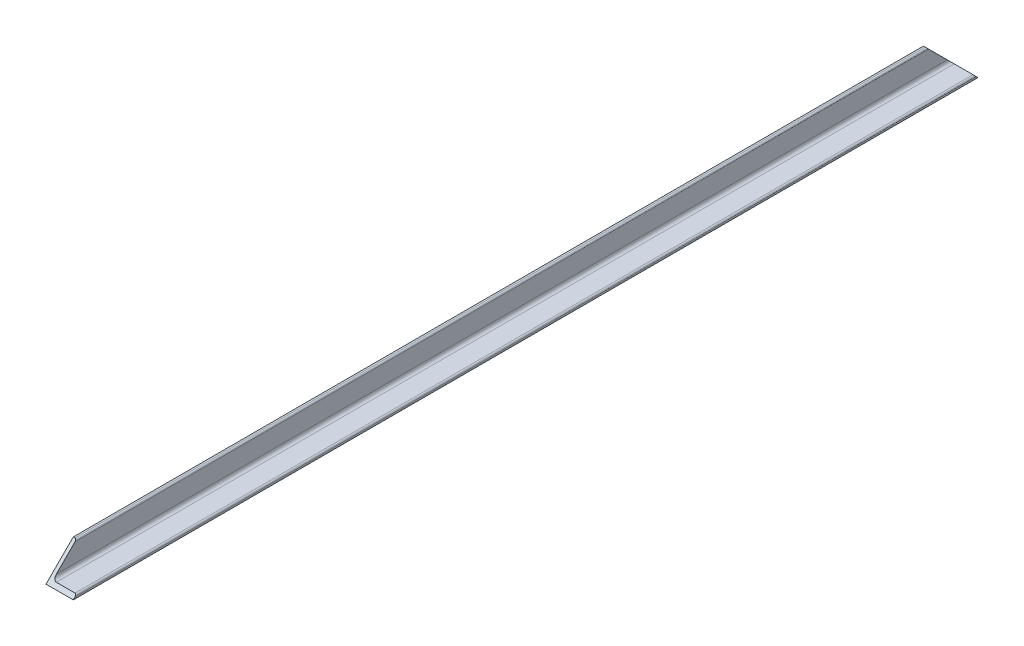
ISO-10303-21;
HEADER;
FILE_DESCRIPTION(('STEP AP214'),'2;1');
FILE_NAME('part.step','',(''),(''),'','','');
FILE_SCHEMA(('AUTOMOTIVE_DESIGN { 1 0 10303 214 1 1 1 1 }'));
ENDSEC;
DATA;
#1=APPLICATION_CONTEXT('core data for automotive mechanical design processes');
#2=APPLICATION_PROTOCOL_DEFINITION('international standard','automotive_design',2000,#1);
#3=PRODUCT_CONTEXT('',#1,'mechanical');
#4=PRODUCT('Part','Part','',(#3));
#5=PRODUCT_RELATED_PRODUCT_CATEGORY('part','',(#4));
#6=PRODUCT_DEFINITION_FORMATION('','',#4);
#7=PRODUCT_DEFINITION_CONTEXT('part definition',#1,'design');
#8=PRODUCT_DEFINITION('design','',#6,#7);
#9=PRODUCT_DEFINITION_SHAPE('','',#8);
#10=(LENGTH_UNIT() NAMED_UNIT(*) SI_UNIT(.MILLI.,.METRE.));
#11=(NAMED_UNIT(*) PLANE_ANGLE_UNIT() SI_UNIT($,.RADIAN.));
#12=(NAMED_UNIT(*) SI_UNIT($,.STERADIAN.) SOLID_ANGLE_UNIT());
#13=UNCERTAINTY_MEASURE_WITH_UNIT(LENGTH_MEASURE(1.E-05),#10,'distance_accuracy_value','');
#14=(GEOMETRIC_REPRESENTATION_CONTEXT(3) GLOBAL_UNCERTAINTY_ASSIGNED_CONTEXT((#13)) GLOBAL_UNIT_ASSIGNED_CONTEXT((#10,
#11,#12)) REPRESENTATION_CONTEXT('',''));
#15=CARTESIAN_POINT('',(0.,0.,0.));
#16=DIRECTION('',(0.,0.,1.));
#17=DIRECTION('',(1.,0.,0.));
#18=AXIS2_PLACEMENT_3D('',#15,#16,#17);
#19=CARTESIAN_POINT('',(0.,631.82499995,631.82499995));
#20=DIRECTION('',(0.,-0.707106781186547,-0.707106781186548));
#21=DIRECTION('',(0.,0.707106781186548,-0.707106781186547));
#22=AXIS2_PLACEMENT_3D('',#19,#20,#21);
#23=PLANE('',#22);
#24=DIRECTION('',(0.,-0.707106781186561,0.707106781186534));
#25=VECTOR('',#24,1.);
#26=CARTESIAN_POINT('',(38.1,2.47650000000016,1261.1734999));
#27=LINE('',#26,#25);
#28=CARTESIAN_POINT('',(38.1,2.47650000000003,1261.1734999));
#29=VERTEX_POINT('',#28);
#30=CARTESIAN_POINT('',(38.1,-1.22995354641856E-08,1263.64999996663));
#31=VERTEX_POINT('',#30);
#32=EDGE_CURVE('E35',#29,#31,#27,.T.);
#33=ORIENTED_EDGE('',*,*,#32,.F.);
#34=CARTESIAN_POINT('',(35.814,2.47650000000003,1261.1734999));
#35=DIRECTION('',(0.,-0.707106781186547,-0.707106781186548));
#36=DIRECTION('',(0.,-0.707106781186548,0.707106781186547));
#37=AXIS2_PLACEMENT_3D('',#34,#35,#36);
#38=ELLIPSE('',#37,3.23289220358491,2.286);
#39=CARTESIAN_POINT('',(35.814,4.7625,1258.8874999));
#40=VERTEX_POINT('',#39);
#41=EDGE_CURVE('E134',#40,#29,#38,.T.);
#42=ORIENTED_EDGE('',*,*,#41,.F.);
#43=DIRECTION('',(1.,0.,0.));
#44=VECTOR('',#43,1.);
#45=CARTESIAN_POINT('',(9.5885,4.76250000000008,1258.8874999));
#46=LINE('',#45,#44);
#47=CARTESIAN_POINT('',(9.5885,4.7625,1258.8874999));
#48=VERTEX_POINT('',#47);
#49=EDGE_CURVE('E126',#48,#40,#46,.T.);
#50=ORIENTED_EDGE('',*,*,#49,.F.);
#51=CARTESIAN_POINT('',(9.5885,9.5885,1254.0614999));
#52=DIRECTION('',(0.,0.707106781186548,0.707106781186548));
#53=DIRECTION('',(0.,-0.707106781186548,0.707106781186548));
#54=AXIS2_PLACEMENT_3D('',#51,#52,#53);
#55=ELLIPSE('',#54,6.82499465201256,4.826);
#56=CARTESIAN_POINT('',(4.7625,9.5885,1254.0614999));
#57=VERTEX_POINT('',#56);
#58=EDGE_CURVE('E129',#57,#48,#55,.T.);
#59=ORIENTED_EDGE('',*,*,#58,.F.);
#60=DIRECTION('',(0.,-0.707106781186547,0.707106781186548));
#61=VECTOR('',#60,1.);
#62=CARTESIAN_POINT('',(4.7625,35.8139999999999,1227.8359999));
#63=LINE('',#62,#61);
#64=CARTESIAN_POINT('',(4.7625,35.814,1227.8359999));
#65=VERTEX_POINT('',#64);
#66=EDGE_CURVE('E10',#65,#57,#63,.T.);
#67=ORIENTED_EDGE('',*,*,#66,.F.);
#68=CARTESIAN_POINT('',(2.4765,35.814,1227.8359999));
#69=DIRECTION('',(0.,-0.707106781186547,-0.707106781186548));
#70=DIRECTION('',(0.,-0.707106781186548,0.707106781186547));
#71=AXIS2_PLACEMENT_3D('',#68,#69,#70);
#72=ELLIPSE('',#71,3.23289220358491,2.286);
#73=CARTESIAN_POINT('',(2.4765,38.1,1225.5499999));
#74=VERTEX_POINT('',#73);
#75=EDGE_CURVE('E97',#74,#65,#72,.T.);
#76=ORIENTED_EDGE('',*,*,#75,.F.);
#77=DIRECTION('',(1.,0.,0.));
#78=VECTOR('',#77,1.);
#79=CARTESIAN_POINT('',(0.,38.1000000000001,1225.5499999));
#80=LINE('',#79,#78);
#81=CARTESIAN_POINT('',(0.,38.1,1225.5499999));
#82=VERTEX_POINT('',#81);
#83=EDGE_CURVE('E104',#82,#74,#80,.T.);
#84=ORIENTED_EDGE('',*,*,#83,.F.);
#85=DIRECTION('',(0.,0.707106781186546,-0.707106781186549));
#86=VECTOR('',#85,1.);
#87=CARTESIAN_POINT('',(0.,-5.00001252547382E-08,1263.64999995));
#88=LINE('',#87,#86);
#89=CARTESIAN_POINT('',(0.,-1.22996083906412E-08,1263.64999996663));
#90=VERTEX_POINT('',#89);
#91=EDGE_CURVE('E117',#90,#82,#88,.T.);
#92=ORIENTED_EDGE('',*,*,#91,.F.);
#93=DIRECTION('',(-1.,0.,0.));
#94=VECTOR('',#93,1.);
#95=CARTESIAN_POINT('',(38.1,0.,1263.65));
#96=LINE('',#95,#94);
#97=EDGE_CURVE('E114',#31,#90,#96,.T.);
#98=ORIENTED_EDGE('',*,*,#97,.F.);
#99=EDGE_LOOP('',(#33,#42,#50,#59,#67,#76,#84,#92,#98));
#100=FACE_BOUND('',#99,.T.);
#101=ADVANCED_FACE('F16',(#100),#23,.F.);
#102=CARTESIAN_POINT('',(4.7625,35.814,0.));
#103=DIRECTION('',(1.,0.,0.));
#104=DIRECTION('',(0.,0.,-1.));
#105=AXIS2_PLACEMENT_3D('',#102,#103,#104);
#106=PLANE('',#105);
#107=ORIENTED_EDGE('',*,*,#66,.T.);
#108=DIRECTION('',(0.,0.,1.));
#109=VECTOR('',#108,1.);
#110=CARTESIAN_POINT('',(4.7625,9.5885,9.58850010000008));
#111=LINE('',#110,#109);
#112=CARTESIAN_POINT('',(4.7625,9.5885,9.58850010000008));
#113=VERTEX_POINT('',#112);
#114=EDGE_CURVE('E122',#113,#57,#111,.T.);
#115=ORIENTED_EDGE('',*,*,#114,.F.);
#116=DIRECTION('',(0.,0.707106781186547,0.707106781186548));
#117=VECTOR('',#116,1.);
#118=CARTESIAN_POINT('',(4.7625,9.5885,9.58850010000008));
#119=LINE('',#118,#117);
#120=CARTESIAN_POINT('',(4.7625,35.814,35.8140001000001));
#121=VERTEX_POINT('',#120);
#122=EDGE_CURVE('E26',#113,#121,#119,.T.);
#123=ORIENTED_EDGE('',*,*,#122,.T.);
#124=DIRECTION('',(0.,0.,1.));
#125=VECTOR('',#124,1.);
#126=CARTESIAN_POINT('',(4.7625,35.814,35.8140001000001));
#127=LINE('',#126,#125);
#128=EDGE_CURVE('E93',#121,#65,#127,.T.);
#129=ORIENTED_EDGE('',*,*,#128,.T.);
#130=EDGE_LOOP('',(#107,#115,#123,#129));
#131=FACE_BOUND('',#130,.T.);
#132=ADVANCED_FACE('F189',(#131),#106,.T.);
#133=CARTESIAN_POINT('',(9.5885,9.5885,0.));
#134=DIRECTION('',(0.,0.,1.));
#135=DIRECTION('',(1.,0.,0.));
#136=AXIS2_PLACEMENT_3D('',#133,#134,#135);
#137=CYLINDRICAL_SURFACE('',#136,4.826);
#138=ORIENTED_EDGE('',*,*,#58,.T.);
#139=DIRECTION('',(0.,0.,1.));
#140=VECTOR('',#139,1.);
#141=CARTESIAN_POINT('',(9.5885,4.7625,4.76250010000008));
#142=LINE('',#141,#140);
#143=CARTESIAN_POINT('',(9.5885,4.7625,4.76250010000008));
#144=VERTEX_POINT('',#143);
#145=EDGE_CURVE('E130',#144,#48,#142,.T.);
#146=ORIENTED_EDGE('',*,*,#145,.F.);
#147=CARTESIAN_POINT('',(9.5885,9.5885,9.58850010000008));
#148=DIRECTION('',(0.,0.707106781186548,-0.707106781186548));
#149=DIRECTION('',(0.,-0.707106781186548,-0.707106781186548));
#150=AXIS2_PLACEMENT_3D('',#147,#148,#149);
#151=ELLIPSE('',#150,6.82499465201256,4.826);
#152=EDGE_CURVE('E125',#144,#113,#151,.T.);
#153=ORIENTED_EDGE('',*,*,#152,.T.);
#154=ORIENTED_EDGE('',*,*,#114,.T.);
#155=EDGE_LOOP('',(#138,#146,#153,#154));
#156=FACE_BOUND('',#155,.T.);
#157=ADVANCED_FACE('F166',(#156),#137,.F.);
#158=CARTESIAN_POINT('',(9.5885,4.7625,0.));
#159=DIRECTION('',(0.,1.,0.));
#160=DIRECTION('',(0.,0.,1.));
#161=AXIS2_PLACEMENT_3D('',#158,#159,#160);
#162=PLANE('',#161);
#163=ORIENTED_EDGE('',*,*,#49,.T.);
#164=DIRECTION('',(0.,0.,1.));
#165=VECTOR('',#164,1.);
#166=CARTESIAN_POINT('',(35.814,4.7625,4.7625001000001));
#167=LINE('',#166,#165);
#168=CARTESIAN_POINT('',(35.814,4.7625,4.7625001000001));
#169=VERTEX_POINT('',#168);
#170=EDGE_CURVE('E137',#169,#40,#167,.T.);
#171=ORIENTED_EDGE('',*,*,#170,.F.);
#172=DIRECTION('',(-1.,0.,0.));
#173=VECTOR('',#172,1.);
#174=CARTESIAN_POINT('',(35.814,4.7625,4.7625001000001));
#175=LINE('',#174,#173);
#176=EDGE_CURVE('E133',#169,#144,#175,.T.);
#177=ORIENTED_EDGE('',*,*,#176,.T.);
#178=ORIENTED_EDGE('',*,*,#145,.T.);
#179=EDGE_LOOP('',(#163,#171,#177,#178));
#180=FACE_BOUND('',#179,.T.);
#181=ADVANCED_FACE('F170',(#180),#162,.T.);
#182=CARTESIAN_POINT('',(35.814,2.47650000000003,0.));
#183=DIRECTION('',(0.,0.,1.));
#184=DIRECTION('',(1.,0.,0.));
#185=AXIS2_PLACEMENT_3D('',#182,#183,#184);
#186=CYLINDRICAL_SURFACE('',#185,2.286);
#187=ORIENTED_EDGE('',*,*,#41,.T.);
#188=DIRECTION('',(0.,0.,1.));
#189=VECTOR('',#188,1.);
#190=CARTESIAN_POINT('',(38.1,2.47650000000003,2.4765001000001));
#191=LINE('',#190,#189);
#192=CARTESIAN_POINT('',(38.1,2.47650000000003,2.4765001000001));
#193=VERTEX_POINT('',#192);
#194=EDGE_CURVE('E121',#193,#29,#191,.T.);
#195=ORIENTED_EDGE('',*,*,#194,.F.);
#196=CARTESIAN_POINT('',(35.814,2.47650000000003,2.4765001000001));
#197=DIRECTION('',(0.,-0.707106781186548,0.707106781186547));
#198=DIRECTION('',(0.,-0.707106781186547,-0.707106781186548));
#199=AXIS2_PLACEMENT_3D('',#196,#197,#198);
#200=ELLIPSE('',#199,3.23289220358491,2.286);
#201=EDGE_CURVE('E140',#193,#169,#200,.T.);
#202=ORIENTED_EDGE('',*,*,#201,.T.);
#203=ORIENTED_EDGE('',*,*,#170,.T.);
#204=EDGE_LOOP('',(#187,#195,#202,#203));
#205=FACE_BOUND('',#204,.T.);
#206=ADVANCED_FACE('F173',(#205),#186,.T.);
#207=CARTESIAN_POINT('',(0.,-5.0000027E-08,5.0000027E-08));
#208=DIRECTION('',(0.,-0.707106781186548,0.707106781186547));
#209=DIRECTION('',(0.,-0.707106781186547,-0.707106781186548));
#210=AXIS2_PLACEMENT_3D('',#207,#208,#209);
#211=PLANE('',#210);
#212=ORIENTED_EDGE('',*,*,#176,.F.);
#213=ORIENTED_EDGE('',*,*,#201,.F.);
#214=DIRECTION('',(0.,0.707106781186547,0.707106781186548));
#215=VECTOR('',#214,1.);
#216=CARTESIAN_POINT('',(38.1,-5.00000352591085E-08,5.00000441408915E-08));
#217=LINE('',#216,#215);
#218=CARTESIAN_POINT('',(38.1,-1.22995689449129E-08,3.33697979428269E-08));
#219=VERTEX_POINT('',#218);
#220=EDGE_CURVE('E145',#219,#193,#217,.T.);
#221=ORIENTED_EDGE('',*,*,#220,.F.);
#222=DIRECTION('',(-1.,0.,0.));
#223=VECTOR('',#222,1.);
#224=CARTESIAN_POINT('',(38.1,0.,0.));
#225=LINE('',#224,#223);
#226=CARTESIAN_POINT('',(0.,-1.22995687708758E-08,3.33698026343034E-08));
#227=VERTEX_POINT('',#226);
#228=EDGE_CURVE('E119',#219,#227,#225,.T.);
#229=ORIENTED_EDGE('',*,*,#228,.T.);
#230=DIRECTION('',(0.,-0.707106781186548,-0.707106781186548));
#231=VECTOR('',#230,1.);
#232=CARTESIAN_POINT('',(0.,38.1,38.1000001000001));
#233=LINE('',#232,#231);
#234=CARTESIAN_POINT('',(0.,38.1,38.1000001000001));
#235=VERTEX_POINT('',#234);
#236=EDGE_CURVE('E102',#235,#227,#233,.T.);
#237=ORIENTED_EDGE('',*,*,#236,.F.);
#238=DIRECTION('',(-1.,0.,0.));
#239=VECTOR('',#238,1.);
#240=CARTESIAN_POINT('',(2.4765,38.1,38.1000001000001));
#241=LINE('',#240,#239);
#242=CARTESIAN_POINT('',(2.4765,38.1,38.1000001000001));
#243=VERTEX_POINT('',#242);
#244=EDGE_CURVE('E85',#243,#235,#241,.T.);
#245=ORIENTED_EDGE('',*,*,#244,.F.);
#246=CARTESIAN_POINT('',(2.4765,35.814,35.8140001000001));
#247=DIRECTION('',(0.,-0.707106781186548,0.707106781186548));
#248=DIRECTION('',(0.,-0.707106781186548,-0.707106781186548));
#249=AXIS2_PLACEMENT_3D('',#246,#247,#248);
#250=ELLIPSE('',#249,3.23289220358491,2.286);
#251=EDGE_CURVE('E91',#121,#243,#250,.T.);
#252=ORIENTED_EDGE('',*,*,#251,.F.);
#253=ORIENTED_EDGE('',*,*,#122,.F.);
#254=ORIENTED_EDGE('',*,*,#152,.F.);
#255=EDGE_LOOP('',(#212,#213,#221,#229,#237,#245,#252,#253,#254));
#256=FACE_BOUND('',#255,.T.);
#257=ADVANCED_FACE('F100',(#256),#211,.F.);
#258=CARTESIAN_POINT('',(0.,0.,0.));
#259=DIRECTION('',(-1.,0.,0.));
#260=DIRECTION('',(0.,0.,1.));
#261=AXIS2_PLACEMENT_3D('',#258,#259,#260);
#262=PLANE('',#261);
#263=ORIENTED_EDGE('',*,*,#91,.T.);
#264=DIRECTION('',(0.,0.,1.));
#265=VECTOR('',#264,1.);
#266=CARTESIAN_POINT('',(0.,38.1,38.1000001000001));
#267=LINE('',#266,#265);
#268=EDGE_CURVE('E105',#235,#82,#267,.T.);
#269=ORIENTED_EDGE('',*,*,#268,.F.);
#270=ORIENTED_EDGE('',*,*,#236,.T.);
#271=DIRECTION('',(0.,0.,1.));
#272=VECTOR('',#271,1.);
#273=CARTESIAN_POINT('',(0.,0.,0.));
#274=LINE('',#273,#272);
#275=EDGE_CURVE('E151',#227,#90,#274,.T.);
#276=ORIENTED_EDGE('',*,*,#275,.T.);
#277=EDGE_LOOP('',(#263,#269,#270,#276));
#278=FACE_BOUND('',#277,.T.);
#279=ADVANCED_FACE('F178',(#278),#262,.T.);
#280=CARTESIAN_POINT('',(38.1,2.47650000000003,0.));
#281=DIRECTION('',(1.,0.,0.));
#282=DIRECTION('',(0.,0.,-1.));
#283=AXIS2_PLACEMENT_3D('',#280,#281,#282);
#284=PLANE('',#283);
#285=ORIENTED_EDGE('',*,*,#32,.T.);
#286=DIRECTION('',(0.,0.,1.));
#287=VECTOR('',#286,1.);
#288=CARTESIAN_POINT('',(38.1,0.,0.));
#289=LINE('',#288,#287);
#290=EDGE_CURVE('E111',#219,#31,#289,.T.);
#291=ORIENTED_EDGE('',*,*,#290,.F.);
#292=ORIENTED_EDGE('',*,*,#220,.T.);
#293=ORIENTED_EDGE('',*,*,#194,.T.);
#294=EDGE_LOOP('',(#285,#291,#292,#293));
#295=FACE_BOUND('',#294,.T.);
#296=ADVANCED_FACE('F174',(#295),#284,.T.);
#297=CARTESIAN_POINT('',(38.1,0.,0.));
#298=DIRECTION('',(0.,-1.,0.));
#299=DIRECTION('',(0.,0.,-1.));
#300=AXIS2_PLACEMENT_3D('',#297,#298,#299);
#301=PLANE('',#300);
#302=ORIENTED_EDGE('',*,*,#97,.T.);
#303=ORIENTED_EDGE('',*,*,#275,.F.);
#304=ORIENTED_EDGE('',*,*,#228,.F.);
#305=ORIENTED_EDGE('',*,*,#290,.T.);
#306=EDGE_LOOP('',(#302,#303,#304,#305));
#307=FACE_BOUND('',#306,.T.);
#308=ADVANCED_FACE('F177',(#307),#301,.T.);
#309=CARTESIAN_POINT('',(0.,38.1,0.));
#310=DIRECTION('',(0.,1.,0.));
#311=DIRECTION('',(0.,0.,1.));
#312=AXIS2_PLACEMENT_3D('',#309,#310,#311);
#313=PLANE('',#312);
#314=ORIENTED_EDGE('',*,*,#83,.T.);
#315=DIRECTION('',(0.,0.,1.));
#316=VECTOR('',#315,1.);
#317=CARTESIAN_POINT('',(2.4765,38.1,38.1000001000001));
#318=LINE('',#317,#316);
#319=EDGE_CURVE('E20',#243,#74,#318,.T.);
#320=ORIENTED_EDGE('',*,*,#319,.F.);
#321=ORIENTED_EDGE('',*,*,#244,.T.);
#322=ORIENTED_EDGE('',*,*,#268,.T.);
#323=EDGE_LOOP('',(#314,#320,#321,#322));
#324=FACE_BOUND('',#323,.T.);
#325=ADVANCED_FACE('F108',(#324),#313,.T.);
#326=CARTESIAN_POINT('',(2.4765,35.814,0.));
#327=DIRECTION('',(0.,0.,1.));
#328=DIRECTION('',(1.,0.,0.));
#329=AXIS2_PLACEMENT_3D('',#326,#327,#328);
#330=CYLINDRICAL_SURFACE('',#329,2.286);
#331=ORIENTED_EDGE('',*,*,#75,.T.);
#332=ORIENTED_EDGE('',*,*,#128,.F.);
#333=ORIENTED_EDGE('',*,*,#251,.T.);
#334=ORIENTED_EDGE('',*,*,#319,.T.);
#335=EDGE_LOOP('',(#331,#332,#333,#334));
#336=FACE_BOUND('',#335,.T.);
#337=ADVANCED_FACE('F18',(#336),#330,.T.);
#338=CLOSED_SHELL('',(#101,#132,#157,#181,#206,#257,#279,#296,#308,#325,#337));
#339=MANIFOLD_SOLID_BREP('B1',#338);
#340=ADVANCED_BREP_SHAPE_REPRESENTATION('',(#18,#339),#14);
#341=SHAPE_DEFINITION_REPRESENTATION(#9,#340);
ENDSEC;
END-ISO-10303-21;
